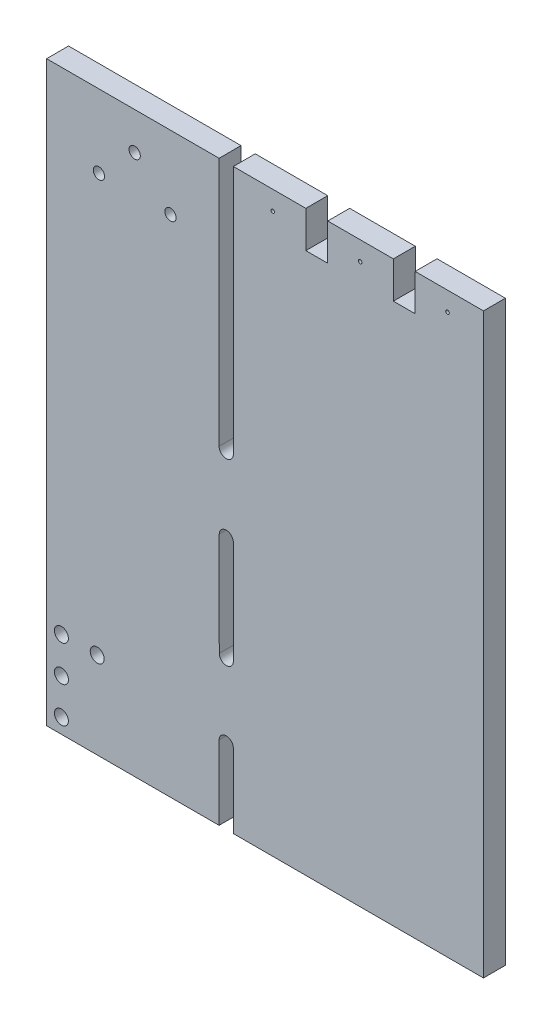
ISO-10303-21;
HEADER;
FILE_DESCRIPTION(('STEP AP214'),'2;1');
FILE_NAME('part.step','',(''),(''),'','','');
FILE_SCHEMA(('AUTOMOTIVE_DESIGN { 1 0 10303 214 1 1 1 1 }'));
ENDSEC;
DATA;
#1=APPLICATION_CONTEXT('core data for automotive mechanical design processes');
#2=APPLICATION_PROTOCOL_DEFINITION('international standard','automotive_design',2000,#1);
#3=PRODUCT_CONTEXT('',#1,'mechanical');
#4=PRODUCT('Part','Part','',(#3));
#5=PRODUCT_RELATED_PRODUCT_CATEGORY('part','',(#4));
#6=PRODUCT_DEFINITION_FORMATION('','',#4);
#7=PRODUCT_DEFINITION_CONTEXT('part definition',#1,'design');
#8=PRODUCT_DEFINITION('design','',#6,#7);
#9=PRODUCT_DEFINITION_SHAPE('','',#8);
#10=(LENGTH_UNIT() NAMED_UNIT(*) SI_UNIT(.MILLI.,.METRE.));
#11=(NAMED_UNIT(*) PLANE_ANGLE_UNIT() SI_UNIT($,.RADIAN.));
#12=(NAMED_UNIT(*) SI_UNIT($,.STERADIAN.) SOLID_ANGLE_UNIT());
#13=UNCERTAINTY_MEASURE_WITH_UNIT(LENGTH_MEASURE(1.E-05),#10,'distance_accuracy_value','');
#14=(GEOMETRIC_REPRESENTATION_CONTEXT(3) GLOBAL_UNCERTAINTY_ASSIGNED_CONTEXT((#13)) GLOBAL_UNIT_ASSIGNED_CONTEXT((#10,
#11,#12)) REPRESENTATION_CONTEXT('',''));
#15=CARTESIAN_POINT('',(0.,0.,0.));
#16=DIRECTION('',(0.,0.,1.));
#17=DIRECTION('',(1.,0.,0.));
#18=AXIS2_PLACEMENT_3D('',#15,#16,#17);
#19=CARTESIAN_POINT('',(0.,0.,0.));
#20=DIRECTION('',(0.,0.,-1.));
#21=DIRECTION('',(-1.,0.,0.));
#22=AXIS2_PLACEMENT_3D('',#19,#20,#21);
#23=PLANE('',#22);
#24=CARTESIAN_POINT('',(22.24999868,39.64999944,0.));
#25=DIRECTION('',(0.,0.,-1.));
#26=DIRECTION('',(-1.,0.,0.));
#27=AXIS2_PLACEMENT_3D('',#24,#25,#26);
#28=CIRCLE('',#27,0.127);
#29=CARTESIAN_POINT('',(22.12299868,39.64999944,0.));
#30=VERTEX_POINT('',#29);
#31=EDGE_CURVE('E247',#30,#30,#28,.F.);
#32=ORIENTED_EDGE('',*,*,#31,.T.);
#33=EDGE_LOOP('',(#32));
#34=FACE_BOUND('',#33,.T.);
#35=CARTESIAN_POINT('',(28.44999898,39.64999944,0.));
#36=DIRECTION('',(0.,0.,-1.));
#37=DIRECTION('',(-1.,0.,0.));
#38=AXIS2_PLACEMENT_3D('',#35,#36,#37);
#39=CIRCLE('',#38,0.127);
#40=CARTESIAN_POINT('',(28.32299898,39.64999944,0.));
#41=VERTEX_POINT('',#40);
#42=EDGE_CURVE('E419',#41,#41,#39,.F.);
#43=ORIENTED_EDGE('',*,*,#42,.T.);
#44=EDGE_LOOP('',(#43));
#45=FACE_BOUND('',#44,.T.);
#46=CARTESIAN_POINT('',(16.04999838,39.64999944,0.));
#47=DIRECTION('',(0.,0.,-1.));
#48=DIRECTION('',(-1.,0.,0.));
#49=AXIS2_PLACEMENT_3D('',#46,#47,#48);
#50=CIRCLE('',#49,0.127);
#51=CARTESIAN_POINT('',(15.92299838,39.64999944,0.));
#52=VERTEX_POINT('',#51);
#53=EDGE_CURVE('E423',#52,#52,#50,.F.);
#54=ORIENTED_EDGE('',*,*,#53,.T.);
#55=EDGE_LOOP('',(#54));
#56=FACE_BOUND('',#55,.T.);
#57=CARTESIAN_POINT('',(8.7900002,35.81500076,0.));
#58=DIRECTION('',(0.,0.,-1.));
#59=DIRECTION('',(-1.,0.,0.));
#60=AXIS2_PLACEMENT_3D('',#57,#58,#59);
#61=CIRCLE('',#60,0.3999992);
#62=CARTESIAN_POINT('',(8.390001,35.81500076,0.));
#63=VERTEX_POINT('',#62);
#64=EDGE_CURVE('E259',#63,#63,#61,.F.);
#65=ORIENTED_EDGE('',*,*,#64,.T.);
#66=EDGE_LOOP('',(#65));
#67=FACE_BOUND('',#66,.T.);
#68=CARTESIAN_POINT('',(12.75,17.89999961853,0.));
#69=DIRECTION('',(0.,0.,-1.));
#70=DIRECTION('',(-1.,0.,0.));
#71=AXIS2_PLACEMENT_3D('',#68,#69,#70);
#72=CIRCLE('',#71,0.5);
#73=CARTESIAN_POINT('',(13.25,17.89999961853,0.));
#74=VERTEX_POINT('',#73);
#75=CARTESIAN_POINT('',(12.25,17.89999961853,0.));
#76=VERTEX_POINT('',#75);
#77=EDGE_CURVE('E265',#74,#76,#72,.F.);
#78=ORIENTED_EDGE('',*,*,#77,.T.);
#79=DIRECTION('',(-0.000136629938551518,0.99999999066613,0.));
#80=VECTOR('',#79,1.);
#81=CARTESIAN_POINT('',(12.25,17.89999961853,0.));
#82=LINE('',#81,#80);
#83=CARTESIAN_POINT('',(12.2510004043576,10.578000068665,0.));
#84=VERTEX_POINT('',#83);
#85=EDGE_CURVE('E256',#84,#76,#82,.T.);
#86=ORIENTED_EDGE('',*,*,#85,.F.);
#87=CARTESIAN_POINT('',(12.750748009729,10.577747674036,0.));
#88=DIRECTION('',(0.,0.,-1.));
#89=DIRECTION('',(-1.,0.,0.));
#90=AXIS2_PLACEMENT_3D('',#87,#88,#89);
#91=CIRCLE('',#90,0.499747669107);
#92=CARTESIAN_POINT('',(13.25,10.600000381472,0.));
#93=VERTEX_POINT('',#92);
#94=EDGE_CURVE('E433',#84,#93,#91,.F.);
#95=ORIENTED_EDGE('',*,*,#94,.T.);
#96=DIRECTION('',(0.,1.,0.));
#97=VECTOR('',#96,1.);
#98=CARTESIAN_POINT('',(13.25,10.60000038147,0.));
#99=LINE('',#98,#97);
#100=EDGE_CURVE('E261',#74,#93,#99,.F.);
#101=ORIENTED_EDGE('',*,*,#100,.F.);
#102=EDGE_LOOP('',(#78,#86,#95,#101));
#103=FACE_BOUND('',#102,.T.);
#104=CARTESIAN_POINT('',(6.2500002,38.35500076,0.));
#105=DIRECTION('',(0.,0.,-1.));
#106=DIRECTION('',(-1.,0.,0.));
#107=AXIS2_PLACEMENT_3D('',#104,#105,#106);
#108=CIRCLE('',#107,0.3999992);
#109=CARTESIAN_POINT('',(5.850001,38.35500076,0.));
#110=VERTEX_POINT('',#109);
#111=EDGE_CURVE('E436',#110,#110,#108,.F.);
#112=ORIENTED_EDGE('',*,*,#111,.T.);
#113=EDGE_LOOP('',(#112));
#114=FACE_BOUND('',#113,.T.);
#115=CARTESIAN_POINT('',(3.7100002,35.81500076,0.));
#116=DIRECTION('',(0.,0.,-1.));
#117=DIRECTION('',(-1.,0.,0.));
#118=AXIS2_PLACEMENT_3D('',#115,#116,#117);
#119=CIRCLE('',#118,0.3999992);
#120=CARTESIAN_POINT('',(3.310001,35.81500076,0.));
#121=VERTEX_POINT('',#120);
#122=EDGE_CURVE('E440',#121,#121,#119,.F.);
#123=ORIENTED_EDGE('',*,*,#122,.T.);
#124=EDGE_LOOP('',(#123));
#125=FACE_BOUND('',#124,.T.);
#126=CARTESIAN_POINT('',(3.59000044,6.14000042,0.));
#127=DIRECTION('',(0.,0.,-1.));
#128=DIRECTION('',(-1.,0.,0.));
#129=AXIS2_PLACEMENT_3D('',#126,#127,#128);
#130=CIRCLE('',#129,0.4953);
#131=CARTESIAN_POINT('',(3.09470044,6.14000042,0.));
#132=VERTEX_POINT('',#131);
#133=EDGE_CURVE('E444',#132,#132,#130,.F.);
#134=ORIENTED_EDGE('',*,*,#133,.T.);
#135=EDGE_LOOP('',(#134));
#136=FACE_BOUND('',#135,.T.);
#137=CARTESIAN_POINT('',(1.05000044,6.14000042,0.));
#138=DIRECTION('',(0.,0.,-1.));
#139=DIRECTION('',(-1.,0.,0.));
#140=AXIS2_PLACEMENT_3D('',#137,#138,#139);
#141=CIRCLE('',#140,0.4953);
#142=CARTESIAN_POINT('',(0.55470044,6.14000042,0.));
#143=VERTEX_POINT('',#142);
#144=EDGE_CURVE('E448',#143,#143,#141,.F.);
#145=ORIENTED_EDGE('',*,*,#144,.T.);
#146=EDGE_LOOP('',(#145));
#147=FACE_BOUND('',#146,.T.);
#148=CARTESIAN_POINT('',(1.05000044,1.06000042,0.));
#149=DIRECTION('',(0.,0.,-1.));
#150=DIRECTION('',(-1.,0.,0.));
#151=AXIS2_PLACEMENT_3D('',#148,#149,#150);
#152=CIRCLE('',#151,0.4953);
#153=CARTESIAN_POINT('',(0.55470044,1.06000042,0.));
#154=VERTEX_POINT('',#153);
#155=EDGE_CURVE('E452',#154,#154,#152,.F.);
#156=ORIENTED_EDGE('',*,*,#155,.T.);
#157=EDGE_LOOP('',(#156));
#158=FACE_BOUND('',#157,.T.);
#159=CARTESIAN_POINT('',(1.05000044,3.60000042,0.));
#160=DIRECTION('',(0.,0.,-1.));
#161=DIRECTION('',(-1.,0.,0.));
#162=AXIS2_PLACEMENT_3D('',#159,#160,#161);
#163=CIRCLE('',#162,0.4953);
#164=CARTESIAN_POINT('',(0.55470044,3.60000042,0.));
#165=VERTEX_POINT('',#164);
#166=EDGE_CURVE('E275',#165,#165,#163,.F.);
#167=ORIENTED_EDGE('',*,*,#166,.T.);
#168=EDGE_LOOP('',(#167));
#169=FACE_BOUND('',#168,.T.);
#170=DIRECTION('',(0.,1.,0.));
#171=VECTOR('',#170,1.);
#172=CARTESIAN_POINT('',(12.239000320435,0.,0.));
#173=LINE('',#172,#171);
#174=CARTESIAN_POINT('',(12.2390003204347,5.25,0.));
#175=VERTEX_POINT('',#174);
#176=CARTESIAN_POINT('',(12.239000320435,0.,0.));
#177=VERTEX_POINT('',#176);
#178=EDGE_CURVE('E115',#175,#177,#173,.F.);
#179=ORIENTED_EDGE('',*,*,#178,.T.);
#180=DIRECTION('',(1.,0.,0.));
#181=VECTOR('',#180,1.);
#182=CARTESIAN_POINT('',(0.,0.,0.));
#183=LINE('',#182,#181);
#184=CARTESIAN_POINT('',(0.,0.,0.));
#185=VERTEX_POINT('',#184);
#186=EDGE_CURVE('E272',#177,#185,#183,.F.);
#187=ORIENTED_EDGE('',*,*,#186,.T.);
#188=DIRECTION('',(0.,1.,0.));
#189=VECTOR('',#188,1.);
#190=CARTESIAN_POINT('',(0.,41.,0.));
#191=LINE('',#190,#189);
#192=CARTESIAN_POINT('',(0.,41.,0.));
#193=VERTEX_POINT('',#192);
#194=EDGE_CURVE('E109',#185,#193,#191,.T.);
#195=ORIENTED_EDGE('',*,*,#194,.T.);
#196=DIRECTION('',(1.,0.,0.));
#197=VECTOR('',#196,1.);
#198=CARTESIAN_POINT('',(12.239000320435,41.,0.));
#199=LINE('',#198,#197);
#200=CARTESIAN_POINT('',(12.239000320435,41.,0.));
#201=VERTEX_POINT('',#200);
#202=EDGE_CURVE('E98',#193,#201,#199,.T.);
#203=ORIENTED_EDGE('',*,*,#202,.T.);
#204=DIRECTION('',(0.,1.,0.));
#205=VECTOR('',#204,1.);
#206=CARTESIAN_POINT('',(12.239000320435,23.299999237061,0.));
#207=LINE('',#206,#205);
#208=CARTESIAN_POINT('',(12.2390003204347,23.299999237061,0.));
#209=VERTEX_POINT('',#208);
#210=EDGE_CURVE('E91',#201,#209,#207,.F.);
#211=ORIENTED_EDGE('',*,*,#210,.T.);
#212=CARTESIAN_POINT('',(12.744500160217,23.299500464452,0.));
#213=DIRECTION('',(0.,0.,-1.));
#214=DIRECTION('',(-1.,0.,0.));
#215=AXIS2_PLACEMENT_3D('',#212,#213,#214);
#216=CIRCLE('',#215,0.50550008585);
#217=CARTESIAN_POINT('',(13.2499999999998,23.299999237061,0.));
#218=VERTEX_POINT('',#217);
#219=EDGE_CURVE('E19',#209,#218,#216,.F.);
#220=ORIENTED_EDGE('',*,*,#219,.T.);
#221=DIRECTION('',(0.,1.,0.));
#222=VECTOR('',#221,1.);
#223=CARTESIAN_POINT('',(13.25,41.,0.));
#224=LINE('',#223,#222);
#225=CARTESIAN_POINT('',(13.25,41.,0.));
#226=VERTEX_POINT('',#225);
#227=EDGE_CURVE('E187',#218,#226,#224,.T.);
#228=ORIENTED_EDGE('',*,*,#227,.T.);
#229=DIRECTION('',(1.,0.,0.));
#230=VECTOR('',#229,1.);
#231=CARTESIAN_POINT('',(18.393999099731,41.,0.));
#232=LINE('',#231,#230);
#233=CARTESIAN_POINT('',(18.393999099731,41.,0.));
#234=VERTEX_POINT('',#233);
#235=EDGE_CURVE('E189',#226,#234,#232,.T.);
#236=ORIENTED_EDGE('',*,*,#235,.T.);
#237=DIRECTION('',(0.,1.,0.));
#238=VECTOR('',#237,1.);
#239=CARTESIAN_POINT('',(18.393999099731,38.400001525879,0.));
#240=LINE('',#239,#238);
#241=CARTESIAN_POINT('',(18.393999099731,38.400001525879,0.));
#242=VERTEX_POINT('',#241);
#243=EDGE_CURVE('E343',#234,#242,#240,.F.);
#244=ORIENTED_EDGE('',*,*,#243,.T.);
#245=DIRECTION('',(1.,0.,0.));
#246=VECTOR('',#245,1.);
#247=CARTESIAN_POINT('',(19.950000762939,38.400001525879,0.));
#248=LINE('',#247,#246);
#249=CARTESIAN_POINT('',(19.950000762939,38.400001525879,0.));
#250=VERTEX_POINT('',#249);
#251=EDGE_CURVE('E337',#242,#250,#248,.T.);
#252=ORIENTED_EDGE('',*,*,#251,.T.);
#253=DIRECTION('',(0.,1.,0.));
#254=VECTOR('',#253,1.);
#255=CARTESIAN_POINT('',(19.950000762939,41.,0.));
#256=LINE('',#255,#254);
#257=CARTESIAN_POINT('',(19.950000762939,41.,0.));
#258=VERTEX_POINT('',#257);
#259=EDGE_CURVE('E331',#250,#258,#256,.T.);
#260=ORIENTED_EDGE('',*,*,#259,.T.);
#261=DIRECTION('',(1.,0.,0.));
#262=VECTOR('',#261,1.);
#263=CARTESIAN_POINT('',(24.607000350952,41.,0.));
#264=LINE('',#263,#262);
#265=CARTESIAN_POINT('',(24.607000350952,41.,0.));
#266=VERTEX_POINT('',#265);
#267=EDGE_CURVE('E325',#258,#266,#264,.T.);
#268=ORIENTED_EDGE('',*,*,#267,.T.);
#269=DIRECTION('',(0.,1.,0.));
#270=VECTOR('',#269,1.);
#271=CARTESIAN_POINT('',(24.607000350952,38.400001525879,0.));
#272=LINE('',#271,#270);
#273=CARTESIAN_POINT('',(24.607000350952,38.400001525879,0.));
#274=VERTEX_POINT('',#273);
#275=EDGE_CURVE('E319',#266,#274,#272,.F.);
#276=ORIENTED_EDGE('',*,*,#275,.T.);
#277=DIRECTION('',(1.,0.,0.));
#278=VECTOR('',#277,1.);
#279=CARTESIAN_POINT('',(26.14999961853,38.400001525879,0.));
#280=LINE('',#279,#278);
#281=CARTESIAN_POINT('',(26.14999961853,38.400001525879,0.));
#282=VERTEX_POINT('',#281);
#283=EDGE_CURVE('E313',#274,#282,#280,.T.);
#284=ORIENTED_EDGE('',*,*,#283,.T.);
#285=DIRECTION('',(0.,1.,0.));
#286=VECTOR('',#285,1.);
#287=CARTESIAN_POINT('',(26.14999961853,41.,0.));
#288=LINE('',#287,#286);
#289=CARTESIAN_POINT('',(26.14999961853,41.,0.));
#290=VERTEX_POINT('',#289);
#291=EDGE_CURVE('E307',#282,#290,#288,.T.);
#292=ORIENTED_EDGE('',*,*,#291,.T.);
#293=DIRECTION('',(1.,0.,0.));
#294=VECTOR('',#293,1.);
#295=CARTESIAN_POINT('',(31.,41.,0.));
#296=LINE('',#295,#294);
#297=CARTESIAN_POINT('',(31.,41.,0.));
#298=VERTEX_POINT('',#297);
#299=EDGE_CURVE('E301',#290,#298,#296,.T.);
#300=ORIENTED_EDGE('',*,*,#299,.T.);
#301=DIRECTION('',(0.,1.,0.));
#302=VECTOR('',#301,1.);
#303=CARTESIAN_POINT('',(31.,0.,0.));
#304=LINE('',#303,#302);
#305=CARTESIAN_POINT('',(31.,0.,0.));
#306=VERTEX_POINT('',#305);
#307=EDGE_CURVE('E295',#298,#306,#304,.F.);
#308=ORIENTED_EDGE('',*,*,#307,.T.);
#309=DIRECTION('',(1.,0.,0.));
#310=VECTOR('',#309,1.);
#311=CARTESIAN_POINT('',(13.25,0.,0.));
#312=LINE('',#311,#310);
#313=CARTESIAN_POINT('',(13.25,0.,0.));
#314=VERTEX_POINT('',#313);
#315=EDGE_CURVE('E289',#306,#314,#312,.F.);
#316=ORIENTED_EDGE('',*,*,#315,.T.);
#317=DIRECTION('',(0.,1.,0.));
#318=VECTOR('',#317,1.);
#319=CARTESIAN_POINT('',(13.25,5.25,0.));
#320=LINE('',#319,#318);
#321=CARTESIAN_POINT('',(13.2499999999998,5.25,0.));
#322=VERTEX_POINT('',#321);
#323=EDGE_CURVE('E282',#314,#322,#320,.T.);
#324=ORIENTED_EDGE('',*,*,#323,.T.);
#325=CARTESIAN_POINT('',(12.744500160217,5.250500201708,0.));
#326=DIRECTION('',(0.,0.,-1.));
#327=DIRECTION('',(-1.,0.,0.));
#328=AXIS2_PLACEMENT_3D('',#325,#326,#327);
#329=CIRCLE('',#328,0.505500087262);
#330=EDGE_CURVE('E458',#322,#175,#329,.F.);
#331=ORIENTED_EDGE('',*,*,#330,.T.);
#332=EDGE_LOOP('',(#179,#187,#195,#203,#211,#220,#228,#236,#244,#252,#260,#268,#276,#284,#292,
#300,#308,#316,#324,#331));
#333=FACE_BOUND('',#332,.T.);
#334=ADVANCED_FACE('F16',(#34,#45,#56,#67,#103,#114,#125,#136,#147,#158,#169,#333),#23,.T.);
#335=CARTESIAN_POINT('',(0.,41.,0.));
#336=DIRECTION('',(1.,0.,0.));
#337=DIRECTION('',(0.,0.,-1.));
#338=AXIS2_PLACEMENT_3D('',#335,#336,#337);
#339=PLANE('',#338);
#340=DIRECTION('',(0.,0.,1.));
#341=VECTOR('',#340,1.);
#342=CARTESIAN_POINT('',(0.,0.,0.));
#343=LINE('',#342,#341);
#344=CARTESIAN_POINT('',(0.,0.,1.55632912));
#345=VERTEX_POINT('',#344);
#346=EDGE_CURVE('E250',#185,#345,#343,.T.);
#347=ORIENTED_EDGE('',*,*,#346,.T.);
#348=DIRECTION('',(0.,1.,0.));
#349=VECTOR('',#348,1.);
#350=CARTESIAN_POINT('',(0.,0.,1.55632912));
#351=LINE('',#350,#349);
#352=CARTESIAN_POINT('',(0.,41.,1.55632912));
#353=VERTEX_POINT('',#352);
#354=EDGE_CURVE('E236',#345,#353,#351,.T.);
#355=ORIENTED_EDGE('',*,*,#354,.T.);
#356=DIRECTION('',(0.,0.,-1.));
#357=VECTOR('',#356,1.);
#358=CARTESIAN_POINT('',(0.,41.,0.));
#359=LINE('',#358,#357);
#360=EDGE_CURVE('E239',#353,#193,#359,.T.);
#361=ORIENTED_EDGE('',*,*,#360,.T.);
#362=ORIENTED_EDGE('',*,*,#194,.F.);
#363=EDGE_LOOP('',(#347,#355,#361,#362));
#364=FACE_BOUND('',#363,.T.);
#365=ADVANCED_FACE('F632',(#364),#339,.F.);
#366=CARTESIAN_POINT('',(12.239000320435,41.,0.));
#367=DIRECTION('',(0.,-1.,0.));
#368=DIRECTION('',(0.,0.,-1.));
#369=AXIS2_PLACEMENT_3D('',#366,#367,#368);
#370=PLANE('',#369);
#371=ORIENTED_EDGE('',*,*,#360,.F.);
#372=DIRECTION('',(-1.,0.,0.));
#373=VECTOR('',#372,1.);
#374=CARTESIAN_POINT('',(0.,41.,1.55632912));
#375=LINE('',#374,#373);
#376=CARTESIAN_POINT('',(12.239000320435,41.,1.55632912));
#377=VERTEX_POINT('',#376);
#378=EDGE_CURVE('E231',#353,#377,#375,.F.);
#379=ORIENTED_EDGE('',*,*,#378,.T.);
#380=DIRECTION('',(0.,0.,1.));
#381=VECTOR('',#380,1.);
#382=CARTESIAN_POINT('',(12.239000320435,41.,0.));
#383=LINE('',#382,#381);
#384=EDGE_CURVE('E225',#377,#201,#383,.F.);
#385=ORIENTED_EDGE('',*,*,#384,.T.);
#386=ORIENTED_EDGE('',*,*,#202,.F.);
#387=EDGE_LOOP('',(#371,#379,#385,#386));
#388=FACE_BOUND('',#387,.T.);
#389=ADVANCED_FACE('F634',(#388),#370,.F.);
#390=CARTESIAN_POINT('',(12.239000320435,23.299999237061,0.));
#391=DIRECTION('',(-1.,0.,0.));
#392=DIRECTION('',(0.,0.,1.));
#393=AXIS2_PLACEMENT_3D('',#390,#391,#392);
#394=PLANE('',#393);
#395=ORIENTED_EDGE('',*,*,#384,.F.);
#396=DIRECTION('',(0.,1.,0.));
#397=VECTOR('',#396,1.);
#398=CARTESIAN_POINT('',(12.239000320435,0.,1.55632912));
#399=LINE('',#398,#397);
#400=CARTESIAN_POINT('',(12.2390003204345,23.299999237061,1.55632912));
#401=VERTEX_POINT('',#400);
#402=EDGE_CURVE('E235',#377,#401,#399,.F.);
#403=ORIENTED_EDGE('',*,*,#402,.T.);
#404=DIRECTION('',(0.,0.,-1.));
#405=VECTOR('',#404,1.);
#406=CARTESIAN_POINT('',(12.2390003204344,23.299999237061,0.));
#407=LINE('',#406,#405);
#408=EDGE_CURVE('E221',#401,#209,#407,.T.);
#409=ORIENTED_EDGE('',*,*,#408,.T.);
#410=ORIENTED_EDGE('',*,*,#210,.F.);
#411=EDGE_LOOP('',(#395,#403,#409,#410));
#412=FACE_BOUND('',#411,.T.);
#413=ADVANCED_FACE('F637',(#412),#394,.F.);
#414=CARTESIAN_POINT('',(12.744500160217,23.299500464452,0.));
#415=DIRECTION('',(0.,0.,-1.));
#416=DIRECTION('',(-1.,0.,0.));
#417=AXIS2_PLACEMENT_3D('',#414,#415,#416);
#418=CYLINDRICAL_SURFACE('',#417,0.50550008585);
#419=ORIENTED_EDGE('',*,*,#408,.F.);
#420=CARTESIAN_POINT('',(12.744500160217,23.299500464452,1.55632912));
#421=DIRECTION('',(0.,0.,-1.));
#422=DIRECTION('',(-1.,0.,0.));
#423=AXIS2_PLACEMENT_3D('',#420,#421,#422);
#424=CIRCLE('',#423,0.50550008585);
#425=CARTESIAN_POINT('',(13.25,23.299999237061,1.55632912));
#426=VERTEX_POINT('',#425);
#427=EDGE_CURVE('E412',#401,#426,#424,.F.);
#428=ORIENTED_EDGE('',*,*,#427,.T.);
#429=DIRECTION('',(0.,0.,-1.));
#430=VECTOR('',#429,1.);
#431=CARTESIAN_POINT('',(13.25,23.299999237061,0.));
#432=LINE('',#431,#430);
#433=EDGE_CURVE('E196',#426,#218,#432,.T.);
#434=ORIENTED_EDGE('',*,*,#433,.T.);
#435=ORIENTED_EDGE('',*,*,#219,.F.);
#436=EDGE_LOOP('',(#419,#428,#434,#435));
#437=FACE_BOUND('',#436,.T.);
#438=ADVANCED_FACE('F640',(#437),#418,.F.);
#439=CARTESIAN_POINT('',(13.25,41.,0.));
#440=DIRECTION('',(1.,0.,0.));
#441=DIRECTION('',(0.,0.,-1.));
#442=AXIS2_PLACEMENT_3D('',#439,#440,#441);
#443=PLANE('',#442);
#444=ORIENTED_EDGE('',*,*,#433,.F.);
#445=DIRECTION('',(0.,1.,0.));
#446=VECTOR('',#445,1.);
#447=CARTESIAN_POINT('',(13.25,0.,1.55632912));
#448=LINE('',#447,#446);
#449=CARTESIAN_POINT('',(13.25,41.,1.55632912));
#450=VERTEX_POINT('',#449);
#451=EDGE_CURVE('E209',#426,#450,#448,.T.);
#452=ORIENTED_EDGE('',*,*,#451,.T.);
#453=DIRECTION('',(0.,0.,-1.));
#454=VECTOR('',#453,1.);
#455=CARTESIAN_POINT('',(13.25,41.,0.));
#456=LINE('',#455,#454);
#457=EDGE_CURVE('E195',#450,#226,#456,.T.);
#458=ORIENTED_EDGE('',*,*,#457,.T.);
#459=ORIENTED_EDGE('',*,*,#227,.F.);
#460=EDGE_LOOP('',(#444,#452,#458,#459));
#461=FACE_BOUND('',#460,.T.);
#462=ADVANCED_FACE('F207',(#461),#443,.F.);
#463=CARTESIAN_POINT('',(18.393999099731,41.,0.));
#464=DIRECTION('',(0.,-1.,0.));
#465=DIRECTION('',(0.,0.,-1.));
#466=AXIS2_PLACEMENT_3D('',#463,#464,#465);
#467=PLANE('',#466);
#468=ORIENTED_EDGE('',*,*,#457,.F.);
#469=DIRECTION('',(-1.,0.,0.));
#470=VECTOR('',#469,1.);
#471=CARTESIAN_POINT('',(0.,41.,1.55632912));
#472=LINE('',#471,#470);
#473=CARTESIAN_POINT('',(18.393999099731,41.,1.55632912));
#474=VERTEX_POINT('',#473);
#475=EDGE_CURVE('E582',#450,#474,#472,.F.);
#476=ORIENTED_EDGE('',*,*,#475,.T.);
#477=DIRECTION('',(0.,0.,1.));
#478=VECTOR('',#477,1.);
#479=CARTESIAN_POINT('',(18.393999099731,41.,0.));
#480=LINE('',#479,#478);
#481=EDGE_CURVE('E203',#474,#234,#480,.F.);
#482=ORIENTED_EDGE('',*,*,#481,.T.);
#483=ORIENTED_EDGE('',*,*,#235,.F.);
#484=EDGE_LOOP('',(#468,#476,#482,#483));
#485=FACE_BOUND('',#484,.T.);
#486=ADVANCED_FACE('F200',(#485),#467,.F.);
#487=CARTESIAN_POINT('',(18.393999099731,38.400001525879,0.));
#488=DIRECTION('',(-1.,0.,0.));
#489=DIRECTION('',(0.,0.,1.));
#490=AXIS2_PLACEMENT_3D('',#487,#488,#489);
#491=PLANE('',#490);
#492=ORIENTED_EDGE('',*,*,#481,.F.);
#493=DIRECTION('',(0.,1.,0.));
#494=VECTOR('',#493,1.);
#495=CARTESIAN_POINT('',(18.393999099731,0.,1.55632912));
#496=LINE('',#495,#494);
#497=CARTESIAN_POINT('',(18.393999099731,38.400001525879,1.55632912));
#498=VERTEX_POINT('',#497);
#499=EDGE_CURVE('E571',#474,#498,#496,.F.);
#500=ORIENTED_EDGE('',*,*,#499,.T.);
#501=DIRECTION('',(0.,0.,-1.));
#502=VECTOR('',#501,1.);
#503=CARTESIAN_POINT('',(18.393999099731,38.400001525879,0.));
#504=LINE('',#503,#502);
#505=EDGE_CURVE('E340',#498,#242,#504,.T.);
#506=ORIENTED_EDGE('',*,*,#505,.T.);
#507=ORIENTED_EDGE('',*,*,#243,.F.);
#508=EDGE_LOOP('',(#492,#500,#506,#507));
#509=FACE_BOUND('',#508,.T.);
#510=ADVANCED_FACE('F762',(#509),#491,.F.);
#511=CARTESIAN_POINT('',(19.950000762939,38.400001525879,0.));
#512=DIRECTION('',(0.,-1.,0.));
#513=DIRECTION('',(0.,0.,-1.));
#514=AXIS2_PLACEMENT_3D('',#511,#512,#513);
#515=PLANE('',#514);
#516=ORIENTED_EDGE('',*,*,#505,.F.);
#517=DIRECTION('',(-1.,0.,0.));
#518=VECTOR('',#517,1.);
#519=CARTESIAN_POINT('',(0.,38.400001525879,1.55632912));
#520=LINE('',#519,#518);
#521=CARTESIAN_POINT('',(19.950000762939,38.400001525879,1.55632912));
#522=VERTEX_POINT('',#521);
#523=EDGE_CURVE('E560',#498,#522,#520,.F.);
#524=ORIENTED_EDGE('',*,*,#523,.T.);
#525=DIRECTION('',(0.,0.,-1.));
#526=VECTOR('',#525,1.);
#527=CARTESIAN_POINT('',(19.950000762939,38.400001525879,0.));
#528=LINE('',#527,#526);
#529=EDGE_CURVE('E334',#522,#250,#528,.T.);
#530=ORIENTED_EDGE('',*,*,#529,.T.);
#531=ORIENTED_EDGE('',*,*,#251,.F.);
#532=EDGE_LOOP('',(#516,#524,#530,#531));
#533=FACE_BOUND('',#532,.T.);
#534=ADVANCED_FACE('F758',(#533),#515,.F.);
#535=CARTESIAN_POINT('',(19.950000762939,41.,0.));
#536=DIRECTION('',(1.,0.,0.));
#537=DIRECTION('',(0.,0.,-1.));
#538=AXIS2_PLACEMENT_3D('',#535,#536,#537);
#539=PLANE('',#538);
#540=ORIENTED_EDGE('',*,*,#529,.F.);
#541=DIRECTION('',(0.,1.,0.));
#542=VECTOR('',#541,1.);
#543=CARTESIAN_POINT('',(19.950000762939,0.,1.55632912));
#544=LINE('',#543,#542);
#545=CARTESIAN_POINT('',(19.950000762939,41.,1.55632912));
#546=VERTEX_POINT('',#545);
#547=EDGE_CURVE('E549',#522,#546,#544,.T.);
#548=ORIENTED_EDGE('',*,*,#547,.T.);
#549=DIRECTION('',(0.,0.,-1.));
#550=VECTOR('',#549,1.);
#551=CARTESIAN_POINT('',(19.950000762939,41.,0.));
#552=LINE('',#551,#550);
#553=EDGE_CURVE('E328',#546,#258,#552,.T.);
#554=ORIENTED_EDGE('',*,*,#553,.T.);
#555=ORIENTED_EDGE('',*,*,#259,.F.);
#556=EDGE_LOOP('',(#540,#548,#554,#555));
#557=FACE_BOUND('',#556,.T.);
#558=ADVANCED_FACE('F754',(#557),#539,.F.);
#559=CARTESIAN_POINT('',(24.607000350952,41.,0.));
#560=DIRECTION('',(0.,-1.,0.));
#561=DIRECTION('',(0.,0.,-1.));
#562=AXIS2_PLACEMENT_3D('',#559,#560,#561);
#563=PLANE('',#562);
#564=ORIENTED_EDGE('',*,*,#553,.F.);
#565=DIRECTION('',(-1.,0.,0.));
#566=VECTOR('',#565,1.);
#567=CARTESIAN_POINT('',(0.,41.,1.55632912));
#568=LINE('',#567,#566);
#569=CARTESIAN_POINT('',(24.607000350952,41.,1.55632912));
#570=VERTEX_POINT('',#569);
#571=EDGE_CURVE('E538',#546,#570,#568,.F.);
#572=ORIENTED_EDGE('',*,*,#571,.T.);
#573=DIRECTION('',(0.,0.,1.));
#574=VECTOR('',#573,1.);
#575=CARTESIAN_POINT('',(24.607000350952,41.,0.));
#576=LINE('',#575,#574);
#577=EDGE_CURVE('E322',#570,#266,#576,.F.);
#578=ORIENTED_EDGE('',*,*,#577,.T.);
#579=ORIENTED_EDGE('',*,*,#267,.F.);
#580=EDGE_LOOP('',(#564,#572,#578,#579));
#581=FACE_BOUND('',#580,.T.);
#582=ADVANCED_FACE('F750',(#581),#563,.F.);
#583=CARTESIAN_POINT('',(24.607000350952,38.400001525879,0.));
#584=DIRECTION('',(-1.,0.,0.));
#585=DIRECTION('',(0.,0.,1.));
#586=AXIS2_PLACEMENT_3D('',#583,#584,#585);
#587=PLANE('',#586);
#588=ORIENTED_EDGE('',*,*,#577,.F.);
#589=DIRECTION('',(0.,1.,0.));
#590=VECTOR('',#589,1.);
#591=CARTESIAN_POINT('',(24.607000350952,0.,1.55632912));
#592=LINE('',#591,#590);
#593=CARTESIAN_POINT('',(24.607000350952,38.400001525879,1.55632912));
#594=VERTEX_POINT('',#593);
#595=EDGE_CURVE('E527',#570,#594,#592,.F.);
#596=ORIENTED_EDGE('',*,*,#595,.T.);
#597=DIRECTION('',(0.,0.,-1.));
#598=VECTOR('',#597,1.);
#599=CARTESIAN_POINT('',(24.607000350952,38.400001525879,0.));
#600=LINE('',#599,#598);
#601=EDGE_CURVE('E316',#594,#274,#600,.T.);
#602=ORIENTED_EDGE('',*,*,#601,.T.);
#603=ORIENTED_EDGE('',*,*,#275,.F.);
#604=EDGE_LOOP('',(#588,#596,#602,#603));
#605=FACE_BOUND('',#604,.T.);
#606=ADVANCED_FACE('F746',(#605),#587,.F.);
#607=CARTESIAN_POINT('',(26.14999961853,38.400001525879,0.));
#608=DIRECTION('',(0.,-1.,0.));
#609=DIRECTION('',(0.,0.,-1.));
#610=AXIS2_PLACEMENT_3D('',#607,#608,#609);
#611=PLANE('',#610);
#612=ORIENTED_EDGE('',*,*,#601,.F.);
#613=DIRECTION('',(-1.,0.,0.));
#614=VECTOR('',#613,1.);
#615=CARTESIAN_POINT('',(0.,38.400001525879,1.55632912));
#616=LINE('',#615,#614);
#617=CARTESIAN_POINT('',(26.14999961853,38.400001525879,1.55632912));
#618=VERTEX_POINT('',#617);
#619=EDGE_CURVE('E516',#594,#618,#616,.F.);
#620=ORIENTED_EDGE('',*,*,#619,.T.);
#621=DIRECTION('',(0.,0.,-1.));
#622=VECTOR('',#621,1.);
#623=CARTESIAN_POINT('',(26.14999961853,38.400001525879,0.));
#624=LINE('',#623,#622);
#625=EDGE_CURVE('E310',#618,#282,#624,.T.);
#626=ORIENTED_EDGE('',*,*,#625,.T.);
#627=ORIENTED_EDGE('',*,*,#283,.F.);
#628=EDGE_LOOP('',(#612,#620,#626,#627));
#629=FACE_BOUND('',#628,.T.);
#630=ADVANCED_FACE('F742',(#629),#611,.F.);
#631=CARTESIAN_POINT('',(26.14999961853,41.,0.));
#632=DIRECTION('',(1.,0.,0.));
#633=DIRECTION('',(0.,0.,-1.));
#634=AXIS2_PLACEMENT_3D('',#631,#632,#633);
#635=PLANE('',#634);
#636=ORIENTED_EDGE('',*,*,#625,.F.);
#637=DIRECTION('',(0.,1.,0.));
#638=VECTOR('',#637,1.);
#639=CARTESIAN_POINT('',(26.14999961853,0.,1.55632912));
#640=LINE('',#639,#638);
#641=CARTESIAN_POINT('',(26.14999961853,41.,1.55632912));
#642=VERTEX_POINT('',#641);
#643=EDGE_CURVE('E505',#618,#642,#640,.T.);
#644=ORIENTED_EDGE('',*,*,#643,.T.);
#645=DIRECTION('',(0.,0.,-1.));
#646=VECTOR('',#645,1.);
#647=CARTESIAN_POINT('',(26.14999961853,41.,0.));
#648=LINE('',#647,#646);
#649=EDGE_CURVE('E304',#642,#290,#648,.T.);
#650=ORIENTED_EDGE('',*,*,#649,.T.);
#651=ORIENTED_EDGE('',*,*,#291,.F.);
#652=EDGE_LOOP('',(#636,#644,#650,#651));
#653=FACE_BOUND('',#652,.T.);
#654=ADVANCED_FACE('F738',(#653),#635,.F.);
#655=CARTESIAN_POINT('',(31.,41.,0.));
#656=DIRECTION('',(0.,-1.,0.));
#657=DIRECTION('',(0.,0.,-1.));
#658=AXIS2_PLACEMENT_3D('',#655,#656,#657);
#659=PLANE('',#658);
#660=ORIENTED_EDGE('',*,*,#649,.F.);
#661=DIRECTION('',(-1.,0.,0.));
#662=VECTOR('',#661,1.);
#663=CARTESIAN_POINT('',(0.,41.,1.55632912));
#664=LINE('',#663,#662);
#665=CARTESIAN_POINT('',(31.,41.,1.55632912));
#666=VERTEX_POINT('',#665);
#667=EDGE_CURVE('E494',#642,#666,#664,.F.);
#668=ORIENTED_EDGE('',*,*,#667,.T.);
#669=DIRECTION('',(0.,0.,1.));
#670=VECTOR('',#669,1.);
#671=CARTESIAN_POINT('',(31.,41.,0.));
#672=LINE('',#671,#670);
#673=EDGE_CURVE('E298',#666,#298,#672,.F.);
#674=ORIENTED_EDGE('',*,*,#673,.T.);
#675=ORIENTED_EDGE('',*,*,#299,.F.);
#676=EDGE_LOOP('',(#660,#668,#674,#675));
#677=FACE_BOUND('',#676,.T.);
#678=ADVANCED_FACE('F734',(#677),#659,.F.);
#679=CARTESIAN_POINT('',(31.,0.,0.));
#680=DIRECTION('',(-1.,0.,0.));
#681=DIRECTION('',(0.,0.,1.));
#682=AXIS2_PLACEMENT_3D('',#679,#680,#681);
#683=PLANE('',#682);
#684=ORIENTED_EDGE('',*,*,#673,.F.);
#685=DIRECTION('',(0.,1.,0.));
#686=VECTOR('',#685,1.);
#687=CARTESIAN_POINT('',(31.,0.,1.55632912));
#688=LINE('',#687,#686);
#689=CARTESIAN_POINT('',(31.,0.,1.55632912));
#690=VERTEX_POINT('',#689);
#691=EDGE_CURVE('E483',#666,#690,#688,.F.);
#692=ORIENTED_EDGE('',*,*,#691,.T.);
#693=DIRECTION('',(0.,0.,1.));
#694=VECTOR('',#693,1.);
#695=CARTESIAN_POINT('',(31.,0.,0.));
#696=LINE('',#695,#694);
#697=EDGE_CURVE('E292',#690,#306,#696,.F.);
#698=ORIENTED_EDGE('',*,*,#697,.T.);
#699=ORIENTED_EDGE('',*,*,#307,.F.);
#700=EDGE_LOOP('',(#684,#692,#698,#699));
#701=FACE_BOUND('',#700,.T.);
#702=ADVANCED_FACE('F730',(#701),#683,.F.);
#703=CARTESIAN_POINT('',(13.25,0.,0.));
#704=DIRECTION('',(0.,1.,0.));
#705=DIRECTION('',(0.,0.,1.));
#706=AXIS2_PLACEMENT_3D('',#703,#704,#705);
#707=PLANE('',#706);
#708=ORIENTED_EDGE('',*,*,#697,.F.);
#709=DIRECTION('',(-1.,0.,0.));
#710=VECTOR('',#709,1.);
#711=CARTESIAN_POINT('',(0.,0.,1.55632912));
#712=LINE('',#711,#710);
#713=CARTESIAN_POINT('',(13.25,0.,1.55632912));
#714=VERTEX_POINT('',#713);
#715=EDGE_CURVE('E479',#690,#714,#712,.T.);
#716=ORIENTED_EDGE('',*,*,#715,.T.);
#717=DIRECTION('',(0.,0.,-1.));
#718=VECTOR('',#717,1.);
#719=CARTESIAN_POINT('',(13.25,0.,0.));
#720=LINE('',#719,#718);
#721=EDGE_CURVE('E286',#714,#314,#720,.T.);
#722=ORIENTED_EDGE('',*,*,#721,.T.);
#723=ORIENTED_EDGE('',*,*,#315,.F.);
#724=EDGE_LOOP('',(#708,#716,#722,#723));
#725=FACE_BOUND('',#724,.T.);
#726=ADVANCED_FACE('F727',(#725),#707,.F.);
#727=CARTESIAN_POINT('',(13.25,5.25,0.));
#728=DIRECTION('',(1.,0.,0.));
#729=DIRECTION('',(0.,0.,-1.));
#730=AXIS2_PLACEMENT_3D('',#727,#728,#729);
#731=PLANE('',#730);
#732=ORIENTED_EDGE('',*,*,#721,.F.);
#733=DIRECTION('',(0.,1.,0.));
#734=VECTOR('',#733,1.);
#735=CARTESIAN_POINT('',(13.25,0.,1.55632912));
#736=LINE('',#735,#734);
#737=CARTESIAN_POINT('',(13.2499999999996,5.25,1.55632912));
#738=VERTEX_POINT('',#737);
#739=EDGE_CURVE('E411',#714,#738,#736,.T.);
#740=ORIENTED_EDGE('',*,*,#739,.T.);
#741=DIRECTION('',(0.,0.,-1.));
#742=VECTOR('',#741,1.);
#743=CARTESIAN_POINT('',(13.2499999999995,5.25,0.));
#744=LINE('',#743,#742);
#745=EDGE_CURVE('E285',#738,#322,#744,.T.);
#746=ORIENTED_EDGE('',*,*,#745,.T.);
#747=ORIENTED_EDGE('',*,*,#323,.F.);
#748=EDGE_LOOP('',(#732,#740,#746,#747));
#749=FACE_BOUND('',#748,.T.);
#750=ADVANCED_FACE('F723',(#749),#731,.F.);
#751=CARTESIAN_POINT('',(12.744500160217,5.250500201708,0.));
#752=DIRECTION('',(0.,0.,-1.));
#753=DIRECTION('',(-1.,0.,0.));
#754=AXIS2_PLACEMENT_3D('',#751,#752,#753);
#755=CYLINDRICAL_SURFACE('',#754,0.505500087262);
#756=ORIENTED_EDGE('',*,*,#745,.F.);
#757=CARTESIAN_POINT('',(12.744500160217,5.250500201708,1.55632912));
#758=DIRECTION('',(0.,0.,-1.));
#759=DIRECTION('',(-1.,0.,0.));
#760=AXIS2_PLACEMENT_3D('',#757,#758,#759);
#761=CIRCLE('',#760,0.505500087262);
#762=CARTESIAN_POINT('',(12.239000320435,5.25,1.55632912));
#763=VERTEX_POINT('',#762);
#764=EDGE_CURVE('E406',#738,#763,#761,.F.);
#765=ORIENTED_EDGE('',*,*,#764,.T.);
#766=DIRECTION('',(0.,0.,1.));
#767=VECTOR('',#766,1.);
#768=CARTESIAN_POINT('',(12.239000320435,5.25,0.));
#769=LINE('',#768,#767);
#770=EDGE_CURVE('E269',#763,#175,#769,.F.);
#771=ORIENTED_EDGE('',*,*,#770,.T.);
#772=ORIENTED_EDGE('',*,*,#330,.F.);
#773=EDGE_LOOP('',(#756,#765,#771,#772));
#774=FACE_BOUND('',#773,.T.);
#775=ADVANCED_FACE('F720',(#774),#755,.F.);
#776=CARTESIAN_POINT('',(12.239000320435,0.,0.));
#777=DIRECTION('',(-1.,0.,0.));
#778=DIRECTION('',(0.,0.,1.));
#779=AXIS2_PLACEMENT_3D('',#776,#777,#778);
#780=PLANE('',#779);
#781=ORIENTED_EDGE('',*,*,#770,.F.);
#782=DIRECTION('',(0.,1.,0.));
#783=VECTOR('',#782,1.);
#784=CARTESIAN_POINT('',(12.239000320435,0.,1.55632912));
#785=LINE('',#784,#783);
#786=CARTESIAN_POINT('',(12.239000320435,0.,1.55632912));
#787=VERTEX_POINT('',#786);
#788=EDGE_CURVE('E410',#763,#787,#785,.F.);
#789=ORIENTED_EDGE('',*,*,#788,.T.);
#790=DIRECTION('',(0.,0.,1.));
#791=VECTOR('',#790,1.);
#792=CARTESIAN_POINT('',(12.239000320435,0.,0.));
#793=LINE('',#792,#791);
#794=EDGE_CURVE('E253',#787,#177,#793,.F.);
#795=ORIENTED_EDGE('',*,*,#794,.T.);
#796=ORIENTED_EDGE('',*,*,#178,.F.);
#797=EDGE_LOOP('',(#781,#789,#795,#796));
#798=FACE_BOUND('',#797,.T.);
#799=ADVANCED_FACE('F621',(#798),#780,.F.);
#800=CARTESIAN_POINT('',(0.,0.,0.));
#801=DIRECTION('',(0.,1.,0.));
#802=DIRECTION('',(0.,0.,1.));
#803=AXIS2_PLACEMENT_3D('',#800,#801,#802);
#804=PLANE('',#803);
#805=ORIENTED_EDGE('',*,*,#794,.F.);
#806=DIRECTION('',(-1.,0.,0.));
#807=VECTOR('',#806,1.);
#808=CARTESIAN_POINT('',(0.,0.,1.55632912));
#809=LINE('',#808,#807);
#810=EDGE_CURVE('E405',#787,#345,#809,.T.);
#811=ORIENTED_EDGE('',*,*,#810,.T.);
#812=ORIENTED_EDGE('',*,*,#346,.F.);
#813=ORIENTED_EDGE('',*,*,#186,.F.);
#814=EDGE_LOOP('',(#805,#811,#812,#813));
#815=FACE_BOUND('',#814,.T.);
#816=ADVANCED_FACE('F625',(#815),#804,.F.);
#817=CARTESIAN_POINT('',(1.05000044,3.60000042,0.));
#818=DIRECTION('',(0.,0.,-1.));
#819=DIRECTION('',(-1.,0.,0.));
#820=AXIS2_PLACEMENT_3D('',#817,#818,#819);
#821=CYLINDRICAL_SURFACE('',#820,0.4953);
#822=CARTESIAN_POINT('',(1.05000044,3.60000042,1.55632912));
#823=DIRECTION('',(0.,0.,-1.));
#824=DIRECTION('',(-1.,0.,0.));
#825=AXIS2_PLACEMENT_3D('',#822,#823,#824);
#826=CIRCLE('',#825,0.4953);
#827=CARTESIAN_POINT('',(0.55470044,3.60000042,1.55632912));
#828=VERTEX_POINT('',#827);
#829=EDGE_CURVE('E401',#828,#828,#826,.F.);
#830=ORIENTED_EDGE('',*,*,#829,.T.);
#831=EDGE_LOOP('',(#830));
#832=FACE_BOUND('',#831,.T.);
#833=ORIENTED_EDGE('',*,*,#166,.F.);
#834=EDGE_LOOP('',(#833));
#835=FACE_BOUND('',#834,.T.);
#836=ADVANCED_FACE('F711',(#832,#835),#821,.F.);
#837=CARTESIAN_POINT('',(1.05000044,1.06000042,0.));
#838=DIRECTION('',(0.,0.,-1.));
#839=DIRECTION('',(-1.,0.,0.));
#840=AXIS2_PLACEMENT_3D('',#837,#838,#839);
#841=CYLINDRICAL_SURFACE('',#840,0.4953);
#842=CARTESIAN_POINT('',(1.05000044,1.06000042,1.55632912));
#843=DIRECTION('',(0.,0.,-1.));
#844=DIRECTION('',(-1.,0.,0.));
#845=AXIS2_PLACEMENT_3D('',#842,#843,#844);
#846=CIRCLE('',#845,0.4953);
#847=CARTESIAN_POINT('',(0.55470044,1.06000042,1.55632912));
#848=VERTEX_POINT('',#847);
#849=EDGE_CURVE('E397',#848,#848,#846,.F.);
#850=ORIENTED_EDGE('',*,*,#849,.T.);
#851=EDGE_LOOP('',(#850));
#852=FACE_BOUND('',#851,.T.);
#853=ORIENTED_EDGE('',*,*,#155,.F.);
#854=EDGE_LOOP('',(#853));
#855=FACE_BOUND('',#854,.T.);
#856=ADVANCED_FACE('F707',(#852,#855),#841,.F.);
#857=CARTESIAN_POINT('',(1.05000044,6.14000042,0.));
#858=DIRECTION('',(0.,0.,-1.));
#859=DIRECTION('',(-1.,0.,0.));
#860=AXIS2_PLACEMENT_3D('',#857,#858,#859);
#861=CYLINDRICAL_SURFACE('',#860,0.4953);
#862=CARTESIAN_POINT('',(1.05000044,6.14000042,1.55632912));
#863=DIRECTION('',(0.,0.,-1.));
#864=DIRECTION('',(-1.,0.,0.));
#865=AXIS2_PLACEMENT_3D('',#862,#863,#864);
#866=CIRCLE('',#865,0.4953);
#867=CARTESIAN_POINT('',(0.55470044,6.14000042,1.55632912));
#868=VERTEX_POINT('',#867);
#869=EDGE_CURVE('E393',#868,#868,#866,.F.);
#870=ORIENTED_EDGE('',*,*,#869,.T.);
#871=EDGE_LOOP('',(#870));
#872=FACE_BOUND('',#871,.T.);
#873=ORIENTED_EDGE('',*,*,#144,.F.);
#874=EDGE_LOOP('',(#873));
#875=FACE_BOUND('',#874,.T.);
#876=ADVANCED_FACE('F703',(#872,#875),#861,.F.);
#877=CARTESIAN_POINT('',(3.59000044,6.14000042,0.));
#878=DIRECTION('',(0.,0.,-1.));
#879=DIRECTION('',(-1.,0.,0.));
#880=AXIS2_PLACEMENT_3D('',#877,#878,#879);
#881=CYLINDRICAL_SURFACE('',#880,0.4953);
#882=CARTESIAN_POINT('',(3.59000044,6.14000042,1.55632912));
#883=DIRECTION('',(0.,0.,-1.));
#884=DIRECTION('',(-1.,0.,0.));
#885=AXIS2_PLACEMENT_3D('',#882,#883,#884);
#886=CIRCLE('',#885,0.4953);
#887=CARTESIAN_POINT('',(3.09470044,6.14000042,1.55632912));
#888=VERTEX_POINT('',#887);
#889=EDGE_CURVE('E389',#888,#888,#886,.F.);
#890=ORIENTED_EDGE('',*,*,#889,.T.);
#891=EDGE_LOOP('',(#890));
#892=FACE_BOUND('',#891,.T.);
#893=ORIENTED_EDGE('',*,*,#133,.F.);
#894=EDGE_LOOP('',(#893));
#895=FACE_BOUND('',#894,.T.);
#896=ADVANCED_FACE('F699',(#892,#895),#881,.F.);
#897=CARTESIAN_POINT('',(3.7100002,35.81500076,0.));
#898=DIRECTION('',(0.,0.,-1.));
#899=DIRECTION('',(-1.,0.,0.));
#900=AXIS2_PLACEMENT_3D('',#897,#898,#899);
#901=CYLINDRICAL_SURFACE('',#900,0.3999992);
#902=CARTESIAN_POINT('',(3.7100002,35.81500076,1.55632912));
#903=DIRECTION('',(0.,0.,-1.));
#904=DIRECTION('',(-1.,0.,0.));
#905=AXIS2_PLACEMENT_3D('',#902,#903,#904);
#906=CIRCLE('',#905,0.3999992);
#907=CARTESIAN_POINT('',(3.310001,35.81500076,1.55632912));
#908=VERTEX_POINT('',#907);
#909=EDGE_CURVE('E385',#908,#908,#906,.F.);
#910=ORIENTED_EDGE('',*,*,#909,.T.);
#911=EDGE_LOOP('',(#910));
#912=FACE_BOUND('',#911,.T.);
#913=ORIENTED_EDGE('',*,*,#122,.F.);
#914=EDGE_LOOP('',(#913));
#915=FACE_BOUND('',#914,.T.);
#916=ADVANCED_FACE('F695',(#912,#915),#901,.F.);
#917=CARTESIAN_POINT('',(6.2500002,38.35500076,0.));
#918=DIRECTION('',(0.,0.,-1.));
#919=DIRECTION('',(-1.,0.,0.));
#920=AXIS2_PLACEMENT_3D('',#917,#918,#919);
#921=CYLINDRICAL_SURFACE('',#920,0.3999992);
#922=CARTESIAN_POINT('',(6.2500002,38.35500076,1.55632912));
#923=DIRECTION('',(0.,0.,-1.));
#924=DIRECTION('',(-1.,0.,0.));
#925=AXIS2_PLACEMENT_3D('',#922,#923,#924);
#926=CIRCLE('',#925,0.3999992);
#927=CARTESIAN_POINT('',(5.850001,38.35500076,1.55632912));
#928=VERTEX_POINT('',#927);
#929=EDGE_CURVE('E381',#928,#928,#926,.F.);
#930=ORIENTED_EDGE('',*,*,#929,.T.);
#931=EDGE_LOOP('',(#930));
#932=FACE_BOUND('',#931,.T.);
#933=ORIENTED_EDGE('',*,*,#111,.F.);
#934=EDGE_LOOP('',(#933));
#935=FACE_BOUND('',#934,.T.);
#936=ADVANCED_FACE('F691',(#932,#935),#921,.F.);
#937=CARTESIAN_POINT('',(12.750748009729,10.577747674036,0.));
#938=DIRECTION('',(0.,0.,-1.));
#939=DIRECTION('',(-1.,0.,0.));
#940=AXIS2_PLACEMENT_3D('',#937,#938,#939);
#941=CYLINDRICAL_SURFACE('',#940,0.499747669107);
#942=CARTESIAN_POINT('',(12.750748009729,10.577747674036,1.55632912));
#943=DIRECTION('',(0.,0.,-1.));
#944=DIRECTION('',(-1.,0.,0.));
#945=AXIS2_PLACEMENT_3D('',#942,#943,#944);
#946=CIRCLE('',#945,0.499747669107);
#947=CARTESIAN_POINT('',(12.2510004043576,10.578000068665,1.55632912));
#948=VERTEX_POINT('',#947);
#949=CARTESIAN_POINT('',(13.25,10.600000381472,1.55632912));
#950=VERTEX_POINT('',#949);
#951=EDGE_CURVE('E377',#948,#950,#946,.F.);
#952=ORIENTED_EDGE('',*,*,#951,.T.);
#953=DIRECTION('',(0.,0.,1.));
#954=VECTOR('',#953,1.);
#955=CARTESIAN_POINT('',(13.25,10.60000038147,0.));
#956=LINE('',#955,#954);
#957=EDGE_CURVE('E266',#93,#950,#956,.T.);
#958=ORIENTED_EDGE('',*,*,#957,.F.);
#959=ORIENTED_EDGE('',*,*,#94,.F.);
#960=DIRECTION('',(0.,0.,1.));
#961=VECTOR('',#960,1.);
#962=CARTESIAN_POINT('',(12.2510004043579,10.578000068665,0.));
#963=LINE('',#962,#961);
#964=EDGE_CURVE('E260',#948,#84,#963,.F.);
#965=ORIENTED_EDGE('',*,*,#964,.F.);
#966=EDGE_LOOP('',(#952,#958,#959,#965));
#967=FACE_BOUND('',#966,.T.);
#968=ADVANCED_FACE('F687',(#967),#941,.F.);
#969=CARTESIAN_POINT('',(13.25,10.60000038147,0.));
#970=DIRECTION('',(-1.,0.,0.));
#971=DIRECTION('',(0.,0.,1.));
#972=AXIS2_PLACEMENT_3D('',#969,#970,#971);
#973=PLANE('',#972);
#974=DIRECTION('',(0.,0.,-1.));
#975=VECTOR('',#974,1.);
#976=CARTESIAN_POINT('',(13.25,17.89999961853,0.));
#977=LINE('',#976,#975);
#978=CARTESIAN_POINT('',(13.25,17.89999961853,1.55632912));
#979=VERTEX_POINT('',#978);
#980=EDGE_CURVE('E432',#979,#74,#977,.T.);
#981=ORIENTED_EDGE('',*,*,#980,.T.);
#982=ORIENTED_EDGE('',*,*,#100,.T.);
#983=ORIENTED_EDGE('',*,*,#957,.T.);
#984=DIRECTION('',(0.,1.,0.));
#985=VECTOR('',#984,1.);
#986=CARTESIAN_POINT('',(13.25,0.,1.55632912));
#987=LINE('',#986,#985);
#988=EDGE_CURVE('E376',#950,#979,#987,.T.);
#989=ORIENTED_EDGE('',*,*,#988,.T.);
#990=EDGE_LOOP('',(#981,#982,#983,#989));
#991=FACE_BOUND('',#990,.T.);
#992=ADVANCED_FACE('F683',(#991),#973,.T.);
#993=CARTESIAN_POINT('',(12.75,17.89999961853,0.));
#994=DIRECTION('',(0.,0.,-1.));
#995=DIRECTION('',(-1.,0.,0.));
#996=AXIS2_PLACEMENT_3D('',#993,#994,#995);
#997=CYLINDRICAL_SURFACE('',#996,0.5);
#998=CARTESIAN_POINT('',(12.75,17.89999961853,1.55632912));
#999=DIRECTION('',(0.,0.,-1.));
#1000=DIRECTION('',(-1.,0.,0.));
#1001=AXIS2_PLACEMENT_3D('',#998,#999,#1000);
#1002=CIRCLE('',#1001,0.5);
#1003=CARTESIAN_POINT('',(12.25,17.89999961853,1.55632912));
#1004=VERTEX_POINT('',#1003);
#1005=EDGE_CURVE('E372',#979,#1004,#1002,.F.);
#1006=ORIENTED_EDGE('',*,*,#1005,.T.);
#1007=DIRECTION('',(0.,0.,1.));
#1008=VECTOR('',#1007,1.);
#1009=CARTESIAN_POINT('',(12.25,17.89999961853,0.));
#1010=LINE('',#1009,#1008);
#1011=EDGE_CURVE('E35',#76,#1004,#1010,.T.);
#1012=ORIENTED_EDGE('',*,*,#1011,.F.);
#1013=ORIENTED_EDGE('',*,*,#77,.F.);
#1014=ORIENTED_EDGE('',*,*,#980,.F.);
#1015=EDGE_LOOP('',(#1006,#1012,#1013,#1014));
#1016=FACE_BOUND('',#1015,.T.);
#1017=ADVANCED_FACE('F680',(#1016),#997,.F.);
#1018=CARTESIAN_POINT('',(12.25,17.89999961853,0.));
#1019=DIRECTION('',(0.99999999066613,0.000136629938551518,0.));
#1020=DIRECTION('',(-0.000136629938551518,0.99999999066613,0.));
#1021=AXIS2_PLACEMENT_3D('',#1018,#1019,#1020);
#1022=PLANE('',#1021);
#1023=ORIENTED_EDGE('',*,*,#964,.T.);
#1024=ORIENTED_EDGE('',*,*,#85,.T.);
#1025=ORIENTED_EDGE('',*,*,#1011,.T.);
#1026=DIRECTION('',(0.000136629938563983,-0.99999999066613,0.));
#1027=VECTOR('',#1026,1.);
#1028=CARTESIAN_POINT('',(12.25,17.89999961853,1.55632912));
#1029=LINE('',#1028,#1027);
#1030=EDGE_CURVE('E371',#1004,#948,#1029,.T.);
#1031=ORIENTED_EDGE('',*,*,#1030,.T.);
#1032=EDGE_LOOP('',(#1023,#1024,#1025,#1031));
#1033=FACE_BOUND('',#1032,.T.);
#1034=ADVANCED_FACE('F676',(#1033),#1022,.T.);
#1035=CARTESIAN_POINT('',(8.7900002,35.81500076,0.));
#1036=DIRECTION('',(0.,0.,-1.));
#1037=DIRECTION('',(-1.,0.,0.));
#1038=AXIS2_PLACEMENT_3D('',#1035,#1036,#1037);
#1039=CYLINDRICAL_SURFACE('',#1038,0.3999992);
#1040=CARTESIAN_POINT('',(8.7900002,35.81500076,1.55632912));
#1041=DIRECTION('',(0.,0.,-1.));
#1042=DIRECTION('',(-1.,0.,0.));
#1043=AXIS2_PLACEMENT_3D('',#1040,#1041,#1042);
#1044=CIRCLE('',#1043,0.3999992);
#1045=CARTESIAN_POINT('',(8.390001,35.81500076,1.55632912));
#1046=VERTEX_POINT('',#1045);
#1047=EDGE_CURVE('E367',#1046,#1046,#1044,.F.);
#1048=ORIENTED_EDGE('',*,*,#1047,.T.);
#1049=EDGE_LOOP('',(#1048));
#1050=FACE_BOUND('',#1049,.T.);
#1051=ORIENTED_EDGE('',*,*,#64,.F.);
#1052=EDGE_LOOP('',(#1051));
#1053=FACE_BOUND('',#1052,.T.);
#1054=ADVANCED_FACE('F672',(#1050,#1053),#1039,.F.);
#1055=CARTESIAN_POINT('',(16.04999838,39.64999944,0.));
#1056=DIRECTION('',(0.,0.,-1.));
#1057=DIRECTION('',(-1.,0.,0.));
#1058=AXIS2_PLACEMENT_3D('',#1055,#1056,#1057);
#1059=CYLINDRICAL_SURFACE('',#1058,0.127);
#1060=CARTESIAN_POINT('',(16.04999838,39.64999944,1.55632912));
#1061=DIRECTION('',(0.,0.,-1.));
#1062=DIRECTION('',(-1.,0.,0.));
#1063=AXIS2_PLACEMENT_3D('',#1060,#1061,#1062);
#1064=CIRCLE('',#1063,0.127);
#1065=CARTESIAN_POINT('',(15.92299838,39.64999944,1.55632912));
#1066=VERTEX_POINT('',#1065);
#1067=EDGE_CURVE('E363',#1066,#1066,#1064,.F.);
#1068=ORIENTED_EDGE('',*,*,#1067,.T.);
#1069=EDGE_LOOP('',(#1068));
#1070=FACE_BOUND('',#1069,.T.);
#1071=ORIENTED_EDGE('',*,*,#53,.F.);
#1072=EDGE_LOOP('',(#1071));
#1073=FACE_BOUND('',#1072,.T.);
#1074=ADVANCED_FACE('F668',(#1070,#1073),#1059,.F.);
#1075=CARTESIAN_POINT('',(28.44999898,39.64999944,0.));
#1076=DIRECTION('',(0.,0.,-1.));
#1077=DIRECTION('',(-1.,0.,0.));
#1078=AXIS2_PLACEMENT_3D('',#1075,#1076,#1077);
#1079=CYLINDRICAL_SURFACE('',#1078,0.127);
#1080=CARTESIAN_POINT('',(28.44999898,39.64999944,1.55632912));
#1081=DIRECTION('',(0.,0.,-1.));
#1082=DIRECTION('',(-1.,0.,0.));
#1083=AXIS2_PLACEMENT_3D('',#1080,#1081,#1082);
#1084=CIRCLE('',#1083,0.127);
#1085=CARTESIAN_POINT('',(28.32299898,39.64999944,1.55632912));
#1086=VERTEX_POINT('',#1085);
#1087=EDGE_CURVE('E26',#1086,#1086,#1084,.F.);
#1088=ORIENTED_EDGE('',*,*,#1087,.T.);
#1089=EDGE_LOOP('',(#1088));
#1090=FACE_BOUND('',#1089,.T.);
#1091=ORIENTED_EDGE('',*,*,#42,.F.);
#1092=EDGE_LOOP('',(#1091));
#1093=FACE_BOUND('',#1092,.T.);
#1094=ADVANCED_FACE('F660',(#1090,#1093),#1079,.F.);
#1095=CARTESIAN_POINT('',(22.24999868,39.64999944,0.));
#1096=DIRECTION('',(0.,0.,-1.));
#1097=DIRECTION('',(-1.,0.,0.));
#1098=AXIS2_PLACEMENT_3D('',#1095,#1096,#1097);
#1099=CYLINDRICAL_SURFACE('',#1098,0.127);
#1100=CARTESIAN_POINT('',(22.24999868,39.64999944,1.55632912));
#1101=DIRECTION('',(0.,0.,-1.));
#1102=DIRECTION('',(-1.,0.,0.));
#1103=AXIS2_PLACEMENT_3D('',#1100,#1101,#1102);
#1104=CIRCLE('',#1103,0.127);
#1105=CARTESIAN_POINT('',(22.12299868,39.64999944,1.55632912));
#1106=VERTEX_POINT('',#1105);
#1107=EDGE_CURVE('E11',#1106,#1106,#1104,.F.);
#1108=ORIENTED_EDGE('',*,*,#1107,.T.);
#1109=EDGE_LOOP('',(#1108));
#1110=FACE_BOUND('',#1109,.T.);
#1111=ORIENTED_EDGE('',*,*,#31,.F.);
#1112=EDGE_LOOP('',(#1111));
#1113=FACE_BOUND('',#1112,.T.);
#1114=ADVANCED_FACE('F654',(#1110,#1113),#1099,.F.);
#1115=CARTESIAN_POINT('',(0.,0.,1.55632912));
#1116=DIRECTION('',(0.,0.,-1.));
#1117=DIRECTION('',(-1.,0.,0.));
#1118=AXIS2_PLACEMENT_3D('',#1115,#1116,#1117);
#1119=PLANE('',#1118);
#1120=ORIENTED_EDGE('',*,*,#1107,.F.);
#1121=EDGE_LOOP('',(#1120));
#1122=FACE_BOUND('',#1121,.T.);
#1123=ORIENTED_EDGE('',*,*,#1087,.F.);
#1124=EDGE_LOOP('',(#1123));
#1125=FACE_BOUND('',#1124,.T.);
#1126=ORIENTED_EDGE('',*,*,#1067,.F.);
#1127=EDGE_LOOP('',(#1126));
#1128=FACE_BOUND('',#1127,.T.);
#1129=ORIENTED_EDGE('',*,*,#1047,.F.);
#1130=EDGE_LOOP('',(#1129));
#1131=FACE_BOUND('',#1130,.T.);
#1132=ORIENTED_EDGE('',*,*,#1005,.F.);
#1133=ORIENTED_EDGE('',*,*,#988,.F.);
#1134=ORIENTED_EDGE('',*,*,#951,.F.);
#1135=ORIENTED_EDGE('',*,*,#1030,.F.);
#1136=EDGE_LOOP('',(#1132,#1133,#1134,#1135));
#1137=FACE_BOUND('',#1136,.T.);
#1138=ORIENTED_EDGE('',*,*,#929,.F.);
#1139=EDGE_LOOP('',(#1138));
#1140=FACE_BOUND('',#1139,.T.);
#1141=ORIENTED_EDGE('',*,*,#909,.F.);
#1142=EDGE_LOOP('',(#1141));
#1143=FACE_BOUND('',#1142,.T.);
#1144=ORIENTED_EDGE('',*,*,#889,.F.);
#1145=EDGE_LOOP('',(#1144));
#1146=FACE_BOUND('',#1145,.T.);
#1147=ORIENTED_EDGE('',*,*,#869,.F.);
#1148=EDGE_LOOP('',(#1147));
#1149=FACE_BOUND('',#1148,.T.);
#1150=ORIENTED_EDGE('',*,*,#849,.F.);
#1151=EDGE_LOOP('',(#1150));
#1152=FACE_BOUND('',#1151,.T.);
#1153=ORIENTED_EDGE('',*,*,#829,.F.);
#1154=EDGE_LOOP('',(#1153));
#1155=FACE_BOUND('',#1154,.T.);
#1156=ORIENTED_EDGE('',*,*,#788,.F.);
#1157=ORIENTED_EDGE('',*,*,#764,.F.);
#1158=ORIENTED_EDGE('',*,*,#739,.F.);
#1159=ORIENTED_EDGE('',*,*,#715,.F.);
#1160=ORIENTED_EDGE('',*,*,#691,.F.);
#1161=ORIENTED_EDGE('',*,*,#667,.F.);
#1162=ORIENTED_EDGE('',*,*,#643,.F.);
#1163=ORIENTED_EDGE('',*,*,#619,.F.);
#1164=ORIENTED_EDGE('',*,*,#595,.F.);
#1165=ORIENTED_EDGE('',*,*,#571,.F.);
#1166=ORIENTED_EDGE('',*,*,#547,.F.);
#1167=ORIENTED_EDGE('',*,*,#523,.F.);
#1168=ORIENTED_EDGE('',*,*,#499,.F.);
#1169=ORIENTED_EDGE('',*,*,#475,.F.);
#1170=ORIENTED_EDGE('',*,*,#451,.F.);
#1171=ORIENTED_EDGE('',*,*,#427,.F.);
#1172=ORIENTED_EDGE('',*,*,#402,.F.);
#1173=ORIENTED_EDGE('',*,*,#378,.F.);
#1174=ORIENTED_EDGE('',*,*,#354,.F.);
#1175=ORIENTED_EDGE('',*,*,#810,.F.);
#1176=EDGE_LOOP('',(#1156,#1157,#1158,#1159,#1160,#1161,#1162,#1163,#1164,#1165,#1166,#1167,
#1168,#1169,#1170,#1171,#1172,#1173,#1174,#1175));
#1177=FACE_BOUND('',#1176,.T.);
#1178=ADVANCED_FACE('F628',(#1122,#1125,#1128,#1131,#1137,#1140,#1143,#1146,#1149,#1152,#1155,
#1177),#1119,.F.);
#1179=CLOSED_SHELL('',(#334,#365,#389,#413,#438,#462,#486,#510,#534,#558,#582,#606,#630,#654,
#678,#702,#726,#750,#775,#799,#816,#836,#856,#876,#896,#916,#936,#968,#992,#1017,#1034,#1054,
#1074,#1094,#1114,#1178));
#1180=MANIFOLD_SOLID_BREP('B1',#1179);
#1181=ADVANCED_BREP_SHAPE_REPRESENTATION('',(#18,#1180),#14);
#1182=SHAPE_DEFINITION_REPRESENTATION(#9,#1181);
ENDSEC;
END-ISO-10303-21;
